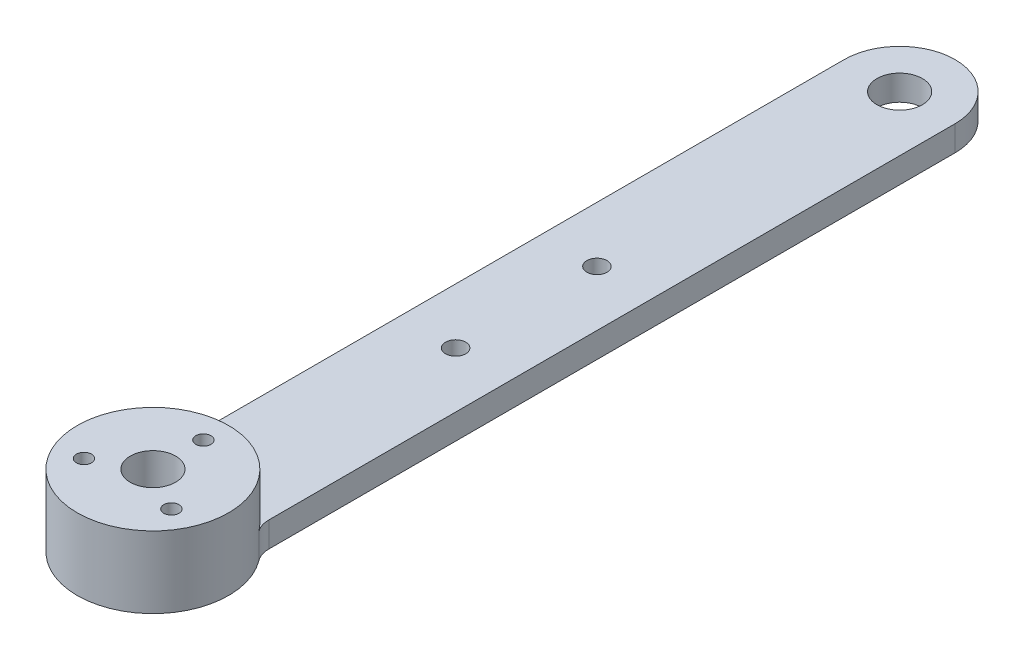
ISO-10303-21;
HEADER;
FILE_DESCRIPTION(('STEP AP214'),'2;1');
FILE_NAME('part.step','',(''),(''),'','','');
FILE_SCHEMA(('AUTOMOTIVE_DESIGN { 1 0 10303 214 1 1 1 1 }'));
ENDSEC;
DATA;
#1=APPLICATION_CONTEXT('core data for automotive mechanical design processes');
#2=APPLICATION_PROTOCOL_DEFINITION('international standard','automotive_design',2000,#1);
#3=PRODUCT_CONTEXT('',#1,'mechanical');
#4=PRODUCT('Part','Part','',(#3));
#5=PRODUCT_RELATED_PRODUCT_CATEGORY('part','',(#4));
#6=PRODUCT_DEFINITION_FORMATION('','',#4);
#7=PRODUCT_DEFINITION_CONTEXT('part definition',#1,'design');
#8=PRODUCT_DEFINITION('design','',#6,#7);
#9=PRODUCT_DEFINITION_SHAPE('','',#8);
#10=(LENGTH_UNIT() NAMED_UNIT(*) SI_UNIT(.MILLI.,.METRE.));
#11=(NAMED_UNIT(*) PLANE_ANGLE_UNIT() SI_UNIT($,.RADIAN.));
#12=(NAMED_UNIT(*) SI_UNIT($,.STERADIAN.) SOLID_ANGLE_UNIT());
#13=UNCERTAINTY_MEASURE_WITH_UNIT(LENGTH_MEASURE(1.E-05),#10,'distance_accuracy_value','');
#14=(GEOMETRIC_REPRESENTATION_CONTEXT(3) GLOBAL_UNCERTAINTY_ASSIGNED_CONTEXT((#13)) GLOBAL_UNIT_ASSIGNED_CONTEXT((#10,
#11,#12)) REPRESENTATION_CONTEXT('',''));
#15=CARTESIAN_POINT('',(0.,0.,0.));
#16=DIRECTION('',(0.,0.,1.));
#17=DIRECTION('',(1.,0.,0.));
#18=AXIS2_PLACEMENT_3D('',#15,#16,#17);
#19=CARTESIAN_POINT('',(-56.5371179039301,5.,-79.1703056768558));
#20=DIRECTION('',(0.,1.,0.));
#21=DIRECTION('',(0.,0.,1.));
#22=AXIS2_PLACEMENT_3D('',#19,#20,#21);
#23=PLANE('',#22);
#24=CARTESIAN_POINT('',(-56.5371179039301,5.,68.8296943231442));
#25=DIRECTION('',(0.,1.,0.));
#26=DIRECTION('',(0.,0.,1.));
#27=AXIS2_PLACEMENT_3D('',#24,#25,#26);
#28=CIRCLE('',#27,15.);
#29=CARTESIAN_POINT('',(-44.5371179039301,5.,59.8296943231442));
#30=VERTEX_POINT('',#29);
#31=CARTESIAN_POINT('',(-68.5371179039301,5.,59.8296943231442));
#32=VERTEX_POINT('',#31);
#33=EDGE_CURVE('E105',#30,#32,#28,.T.);
#34=ORIENTED_EDGE('',*,*,#33,.F.);
#35=CARTESIAN_POINT('',(-40.5371179039301,5.,56.8296943231442));
#36=DIRECTION('',(0.,-1.,0.));
#37=DIRECTION('',(0.,0.,1.));
#38=AXIS2_PLACEMENT_3D('',#35,#36,#37);
#39=CIRCLE('',#38,5.);
#40=CARTESIAN_POINT('',(-45.5371179039301,5.,56.8296943231442));
#41=VERTEX_POINT('',#40);
#42=EDGE_CURVE('E109',#30,#41,#39,.T.);
#43=ORIENTED_EDGE('',*,*,#42,.T.);
#44=DIRECTION('',(0.,0.,-1.));
#45=VECTOR('',#44,1.);
#46=CARTESIAN_POINT('',(-45.5371179039301,5.,-79.1703056768558));
#47=LINE('',#46,#45);
#48=CARTESIAN_POINT('',(-45.5371179039301,5.,-79.1703056768558));
#49=VERTEX_POINT('',#48);
#50=EDGE_CURVE('E57',#41,#49,#47,.T.);
#51=ORIENTED_EDGE('',*,*,#50,.T.);
#52=CARTESIAN_POINT('',(-56.5371179039301,5.,-79.1703056768558));
#53=DIRECTION('',(0.,1.,0.));
#54=DIRECTION('',(0.,0.,1.));
#55=AXIS2_PLACEMENT_3D('',#52,#53,#54);
#56=CIRCLE('',#55,11.);
#57=CARTESIAN_POINT('',(-67.5371179039301,5.,-79.1703056768558));
#58=VERTEX_POINT('',#57);
#59=EDGE_CURVE('E177',#49,#58,#56,.T.);
#60=ORIENTED_EDGE('',*,*,#59,.T.);
#61=DIRECTION('',(0.,0.,1.));
#62=VECTOR('',#61,1.);
#63=CARTESIAN_POINT('',(-67.5371179039301,5.,-79.1703056768558));
#64=LINE('',#63,#62);
#65=CARTESIAN_POINT('',(-67.5371179039301,5.,56.8296943231442));
#66=VERTEX_POINT('',#65);
#67=EDGE_CURVE('E95',#58,#66,#64,.T.);
#68=ORIENTED_EDGE('',*,*,#67,.T.);
#69=CARTESIAN_POINT('',(-72.5371179039301,5.,56.8296943231442));
#70=DIRECTION('',(0.,-1.,0.));
#71=DIRECTION('',(0.,0.,-1.));
#72=AXIS2_PLACEMENT_3D('',#69,#70,#71);
#73=CIRCLE('',#72,5.);
#74=EDGE_CURVE('E101',#66,#32,#73,.T.);
#75=ORIENTED_EDGE('',*,*,#74,.T.);
#76=EDGE_LOOP('',(#34,#43,#51,#60,#68,#75));
#77=FACE_BOUND('',#76,.T.);
#78=CARTESIAN_POINT('',(-56.5371179039301,5.,-19.1703056768558));
#79=DIRECTION('',(0.,1.,0.));
#80=DIRECTION('',(0.,0.,1.));
#81=AXIS2_PLACEMENT_3D('',#78,#79,#80);
#82=CIRCLE('',#81,2.);
#83=CARTESIAN_POINT('',(-56.5371179039301,5.,-17.1703056768558));
#84=VERTEX_POINT('',#83);
#85=EDGE_CURVE('E161',#84,#84,#82,.T.);
#86=ORIENTED_EDGE('',*,*,#85,.F.);
#87=EDGE_LOOP('',(#86));
#88=FACE_BOUND('',#87,.T.);
#89=CARTESIAN_POINT('',(-56.5371179039301,5.,-79.1703056768558));
#90=DIRECTION('',(0.,1.,0.));
#91=DIRECTION('',(0.,0.,1.));
#92=AXIS2_PLACEMENT_3D('',#89,#90,#91);
#93=CIRCLE('',#92,4.5);
#94=CARTESIAN_POINT('',(-56.5371179039301,5.,-74.6703056768558));
#95=VERTEX_POINT('',#94);
#96=EDGE_CURVE('E169',#95,#95,#93,.T.);
#97=ORIENTED_EDGE('',*,*,#96,.F.);
#98=EDGE_LOOP('',(#97));
#99=FACE_BOUND('',#98,.T.);
#100=CARTESIAN_POINT('',(-56.5371179039301,5.,8.82969432314421));
#101=DIRECTION('',(0.,1.,0.));
#102=DIRECTION('',(0.,0.,1.));
#103=AXIS2_PLACEMENT_3D('',#100,#101,#102);
#104=CIRCLE('',#103,2.);
#105=CARTESIAN_POINT('',(-56.5371179039301,5.,10.8296943231442));
#106=VERTEX_POINT('',#105);
#107=EDGE_CURVE('E153',#106,#106,#104,.T.);
#108=ORIENTED_EDGE('',*,*,#107,.F.);
#109=EDGE_LOOP('',(#108));
#110=FACE_BOUND('',#109,.T.);
#111=ADVANCED_FACE('F39',(#77,#88,#99,#110),#23,.T.);
#112=CARTESIAN_POINT('',(-56.5371179039301,0.,-79.1703056768558));
#113=DIRECTION('',(0.,1.,0.));
#114=DIRECTION('',(0.,0.,1.));
#115=AXIS2_PLACEMENT_3D('',#112,#113,#114);
#116=PLANE('',#115);
#117=CARTESIAN_POINT('',(-56.5371179039301,0.,-79.1703056768558));
#118=DIRECTION('',(0.,1.,0.));
#119=DIRECTION('',(0.,0.,1.));
#120=AXIS2_PLACEMENT_3D('',#117,#118,#119);
#121=CIRCLE('',#120,11.);
#122=CARTESIAN_POINT('',(-45.5371179039301,0.,-79.1703056768558));
#123=VERTEX_POINT('',#122);
#124=CARTESIAN_POINT('',(-67.5371179039301,0.,-79.1703056768558));
#125=VERTEX_POINT('',#124);
#126=EDGE_CURVE('E173',#123,#125,#121,.T.);
#127=ORIENTED_EDGE('',*,*,#126,.F.);
#128=DIRECTION('',(0.,0.,-1.));
#129=VECTOR('',#128,1.);
#130=CARTESIAN_POINT('',(-45.5371179039301,0.,-79.1703056768558));
#131=LINE('',#130,#129);
#132=CARTESIAN_POINT('',(-45.5371179039301,0.,56.8296943231442));
#133=VERTEX_POINT('',#132);
#134=EDGE_CURVE('E87',#133,#123,#131,.T.);
#135=ORIENTED_EDGE('',*,*,#134,.F.);
#136=CARTESIAN_POINT('',(-40.5371179039301,0.,56.8296943231442));
#137=DIRECTION('',(0.,-1.,0.));
#138=DIRECTION('',(0.,0.,1.));
#139=AXIS2_PLACEMENT_3D('',#136,#137,#138);
#140=CIRCLE('',#139,5.);
#141=CARTESIAN_POINT('',(-44.5371179039301,0.,59.8296943231442));
#142=VERTEX_POINT('',#141);
#143=EDGE_CURVE('E81',#142,#133,#140,.T.);
#144=ORIENTED_EDGE('',*,*,#143,.F.);
#145=CARTESIAN_POINT('',(-56.5371179039301,0.,68.8296943231442));
#146=DIRECTION('',(0.,1.,0.));
#147=DIRECTION('',(0.,0.,1.));
#148=AXIS2_PLACEMENT_3D('',#145,#146,#147);
#149=CIRCLE('',#148,15.);
#150=CARTESIAN_POINT('',(-68.5371179039301,0.,59.8296943231442));
#151=VERTEX_POINT('',#150);
#152=EDGE_CURVE('E195',#151,#142,#149,.T.);
#153=ORIENTED_EDGE('',*,*,#152,.F.);
#154=CARTESIAN_POINT('',(-72.5371179039301,0.,56.8296943231442));
#155=DIRECTION('',(0.,-1.,0.));
#156=DIRECTION('',(0.,0.,-1.));
#157=AXIS2_PLACEMENT_3D('',#154,#155,#156);
#158=CIRCLE('',#157,5.);
#159=CARTESIAN_POINT('',(-67.5371179039301,0.,56.8296943231442));
#160=VERTEX_POINT('',#159);
#161=EDGE_CURVE('E115',#160,#151,#158,.T.);
#162=ORIENTED_EDGE('',*,*,#161,.F.);
#163=DIRECTION('',(0.,0.,1.));
#164=VECTOR('',#163,1.);
#165=CARTESIAN_POINT('',(-67.5371179039301,0.,-79.1703056768558));
#166=LINE('',#165,#164);
#167=EDGE_CURVE('E190',#125,#160,#166,.T.);
#168=ORIENTED_EDGE('',*,*,#167,.F.);
#169=EDGE_LOOP('',(#127,#135,#144,#153,#162,#168));
#170=FACE_BOUND('',#169,.T.);
#171=CARTESIAN_POINT('',(-56.5371179039301,0.,-79.1703056768558));
#172=DIRECTION('',(0.,1.,0.));
#173=DIRECTION('',(0.,0.,1.));
#174=AXIS2_PLACEMENT_3D('',#171,#172,#173);
#175=CIRCLE('',#174,4.5);
#176=CARTESIAN_POINT('',(-56.5371179039301,0.,-74.6703056768558));
#177=VERTEX_POINT('',#176);
#178=EDGE_CURVE('E165',#177,#177,#175,.T.);
#179=ORIENTED_EDGE('',*,*,#178,.T.);
#180=EDGE_LOOP('',(#179));
#181=FACE_BOUND('',#180,.T.);
#182=CARTESIAN_POINT('',(-56.5371179039301,0.,-19.1703056768558));
#183=DIRECTION('',(0.,1.,0.));
#184=DIRECTION('',(0.,0.,1.));
#185=AXIS2_PLACEMENT_3D('',#182,#183,#184);
#186=CIRCLE('',#185,2.);
#187=CARTESIAN_POINT('',(-56.5371179039301,0.,-17.1703056768558));
#188=VERTEX_POINT('',#187);
#189=EDGE_CURVE('E157',#188,#188,#186,.T.);
#190=ORIENTED_EDGE('',*,*,#189,.T.);
#191=EDGE_LOOP('',(#190));
#192=FACE_BOUND('',#191,.T.);
#193=CARTESIAN_POINT('',(-56.5371179039301,0.,8.82969432314421));
#194=DIRECTION('',(0.,1.,0.));
#195=DIRECTION('',(0.,0.,1.));
#196=AXIS2_PLACEMENT_3D('',#193,#194,#195);
#197=CIRCLE('',#196,2.);
#198=CARTESIAN_POINT('',(-56.5371179039301,0.,10.8296943231442));
#199=VERTEX_POINT('',#198);
#200=EDGE_CURVE('E152',#199,#199,#197,.T.);
#201=ORIENTED_EDGE('',*,*,#200,.T.);
#202=EDGE_LOOP('',(#201));
#203=FACE_BOUND('',#202,.T.);
#204=CARTESIAN_POINT('',(-56.5371179039301,0.,68.8296943231442));
#205=DIRECTION('',(0.,1.,0.));
#206=DIRECTION('',(0.,0.,1.));
#207=AXIS2_PLACEMENT_3D('',#204,#205,#206);
#208=CIRCLE('',#207,4.5);
#209=CARTESIAN_POINT('',(-56.5371179039301,0.,73.3296943231442));
#210=VERTEX_POINT('',#209);
#211=EDGE_CURVE('E148',#210,#210,#208,.T.);
#212=ORIENTED_EDGE('',*,*,#211,.T.);
#213=EDGE_LOOP('',(#212));
#214=FACE_BOUND('',#213,.T.);
#215=CARTESIAN_POINT('',(-65.1973719417745,0.,73.8296943231443));
#216=DIRECTION('',(0.,1.,0.));
#217=DIRECTION('',(0.,0.,1.));
#218=AXIS2_PLACEMENT_3D('',#215,#216,#217);
#219=CIRCLE('',#218,1.5);
#220=CARTESIAN_POINT('',(-65.1973719417745,0.,75.3296943231443));
#221=VERTEX_POINT('',#220);
#222=EDGE_CURVE('E144',#221,#221,#219,.T.);
#223=ORIENTED_EDGE('',*,*,#222,.T.);
#224=EDGE_LOOP('',(#223));
#225=FACE_BOUND('',#224,.T.);
#226=CARTESIAN_POINT('',(-47.8768638660856,0.,73.8296943231441));
#227=DIRECTION('',(0.,1.,0.));
#228=DIRECTION('',(0.,0.,1.));
#229=AXIS2_PLACEMENT_3D('',#226,#227,#228);
#230=CIRCLE('',#229,1.49999999999997);
#231=CARTESIAN_POINT('',(-47.8768638660856,0.,75.3296943231441));
#232=VERTEX_POINT('',#231);
#233=EDGE_CURVE('E140',#232,#232,#230,.T.);
#234=ORIENTED_EDGE('',*,*,#233,.T.);
#235=EDGE_LOOP('',(#234));
#236=FACE_BOUND('',#235,.T.);
#237=CARTESIAN_POINT('',(-56.5371179039301,0.,58.8296943231442));
#238=DIRECTION('',(0.,1.,0.));
#239=DIRECTION('',(0.,0.,1.));
#240=AXIS2_PLACEMENT_3D('',#237,#238,#239);
#241=CIRCLE('',#240,1.5);
#242=CARTESIAN_POINT('',(-56.5371179039301,0.,60.3296943231442));
#243=VERTEX_POINT('',#242);
#244=EDGE_CURVE('E131',#243,#243,#241,.T.);
#245=ORIENTED_EDGE('',*,*,#244,.T.);
#246=EDGE_LOOP('',(#245));
#247=FACE_BOUND('',#246,.T.);
#248=ADVANCED_FACE('F211',(#170,#181,#192,#203,#214,#225,#236,#247),#116,.F.);
#249=CARTESIAN_POINT('',(-56.5371179039301,5.,-79.1703056768558));
#250=DIRECTION('',(0.,-1.,0.));
#251=DIRECTION('',(0.,0.,-1.));
#252=AXIS2_PLACEMENT_3D('',#249,#250,#251);
#253=CYLINDRICAL_SURFACE('',#252,11.);
#254=ORIENTED_EDGE('',*,*,#126,.T.);
#255=DIRECTION('',(0.,-1.,0.));
#256=VECTOR('',#255,1.);
#257=CARTESIAN_POINT('',(-67.5371179039301,5.,-79.1703056768558));
#258=LINE('',#257,#256);
#259=EDGE_CURVE('E11',#58,#125,#258,.T.);
#260=ORIENTED_EDGE('',*,*,#259,.F.);
#261=ORIENTED_EDGE('',*,*,#59,.F.);
#262=DIRECTION('',(0.,-1.,0.));
#263=VECTOR('',#262,1.);
#264=CARTESIAN_POINT('',(-45.5371179039301,5.,-79.1703056768558));
#265=LINE('',#264,#263);
#266=EDGE_CURVE('E186',#49,#123,#265,.T.);
#267=ORIENTED_EDGE('',*,*,#266,.T.);
#268=EDGE_LOOP('',(#254,#260,#261,#267));
#269=FACE_BOUND('',#268,.T.);
#270=ADVANCED_FACE('F41',(#269),#253,.T.);
#271=CARTESIAN_POINT('',(-67.5371179039301,5.,-79.1703056768558));
#272=DIRECTION('',(1.,0.,0.));
#273=DIRECTION('',(0.,0.,-1.));
#274=AXIS2_PLACEMENT_3D('',#271,#272,#273);
#275=PLANE('',#274);
#276=ORIENTED_EDGE('',*,*,#167,.T.);
#277=DIRECTION('',(0.,-1.,0.));
#278=VECTOR('',#277,1.);
#279=CARTESIAN_POINT('',(-67.5371179039301,5.,56.8296943231442));
#280=LINE('',#279,#278);
#281=EDGE_CURVE('E49',#66,#160,#280,.T.);
#282=ORIENTED_EDGE('',*,*,#281,.F.);
#283=ORIENTED_EDGE('',*,*,#67,.F.);
#284=ORIENTED_EDGE('',*,*,#259,.T.);
#285=EDGE_LOOP('',(#276,#282,#283,#284));
#286=FACE_BOUND('',#285,.T.);
#287=ADVANCED_FACE('F219',(#286),#275,.F.);
#288=CARTESIAN_POINT('',(-72.5371179039301,5.,56.8296943231442));
#289=DIRECTION('',(0.,-1.,0.));
#290=DIRECTION('',(0.,0.,-1.));
#291=AXIS2_PLACEMENT_3D('',#288,#289,#290);
#292=CYLINDRICAL_SURFACE('',#291,5.);
#293=ORIENTED_EDGE('',*,*,#161,.T.);
#294=DIRECTION('',(0.,-1.,0.));
#295=VECTOR('',#294,1.);
#296=CARTESIAN_POINT('',(-68.5371179039301,5.,59.8296943231442));
#297=LINE('',#296,#295);
#298=EDGE_CURVE('E112',#32,#151,#297,.T.);
#299=ORIENTED_EDGE('',*,*,#298,.F.);
#300=ORIENTED_EDGE('',*,*,#74,.F.);
#301=ORIENTED_EDGE('',*,*,#281,.T.);
#302=EDGE_LOOP('',(#293,#299,#300,#301));
#303=FACE_BOUND('',#302,.T.);
#304=ADVANCED_FACE('F113',(#303),#292,.F.);
#305=CARTESIAN_POINT('',(-56.5371179039301,5.,68.8296943231442));
#306=DIRECTION('',(0.,-1.,0.));
#307=DIRECTION('',(0.,0.,-1.));
#308=AXIS2_PLACEMENT_3D('',#305,#306,#307);
#309=CYLINDRICAL_SURFACE('',#308,15.);
#310=ORIENTED_EDGE('',*,*,#152,.T.);
#311=DIRECTION('',(0.,-1.,0.));
#312=VECTOR('',#311,1.);
#313=CARTESIAN_POINT('',(-44.5371179039301,5.,59.8296943231442));
#314=LINE('',#313,#312);
#315=EDGE_CURVE('E119',#30,#142,#314,.T.);
#316=ORIENTED_EDGE('',*,*,#315,.F.);
#317=ORIENTED_EDGE('',*,*,#33,.T.);
#318=ORIENTED_EDGE('',*,*,#298,.T.);
#319=EDGE_LOOP('',(#310,#316,#317,#318));
#320=FACE_BOUND('',#319,.T.);
#321=CARTESIAN_POINT('',(-56.5371179039301,14.2,68.8296943231442));
#322=DIRECTION('',(0.,1.,0.));
#323=DIRECTION('',(0.,0.,1.));
#324=AXIS2_PLACEMENT_3D('',#321,#322,#323);
#325=CIRCLE('',#324,15.);
#326=CARTESIAN_POINT('',(-56.5371179039301,14.2,83.8296943231442));
#327=VERTEX_POINT('',#326);
#328=EDGE_CURVE('E125',#327,#327,#325,.T.);
#329=ORIENTED_EDGE('',*,*,#328,.F.);
#330=EDGE_LOOP('',(#329));
#331=FACE_BOUND('',#330,.T.);
#332=ADVANCED_FACE('F122',(#320,#331),#309,.T.);
#333=CARTESIAN_POINT('',(-40.5371179039301,5.,56.8296943231442));
#334=DIRECTION('',(0.,-1.,0.));
#335=DIRECTION('',(0.,0.,-1.));
#336=AXIS2_PLACEMENT_3D('',#333,#334,#335);
#337=CYLINDRICAL_SURFACE('',#336,5.);
#338=ORIENTED_EDGE('',*,*,#143,.T.);
#339=DIRECTION('',(0.,-1.,0.));
#340=VECTOR('',#339,1.);
#341=CARTESIAN_POINT('',(-45.5371179039301,5.,56.8296943231442));
#342=LINE('',#341,#340);
#343=EDGE_CURVE('E204',#41,#133,#342,.T.);
#344=ORIENTED_EDGE('',*,*,#343,.F.);
#345=ORIENTED_EDGE('',*,*,#42,.F.);
#346=ORIENTED_EDGE('',*,*,#315,.T.);
#347=EDGE_LOOP('',(#338,#344,#345,#346));
#348=FACE_BOUND('',#347,.T.);
#349=ADVANCED_FACE('F214',(#348),#337,.F.);
#350=CARTESIAN_POINT('',(-45.5371179039301,5.,-79.1703056768558));
#351=DIRECTION('',(-1.,0.,0.));
#352=DIRECTION('',(0.,0.,1.));
#353=AXIS2_PLACEMENT_3D('',#350,#351,#352);
#354=PLANE('',#353);
#355=ORIENTED_EDGE('',*,*,#134,.T.);
#356=ORIENTED_EDGE('',*,*,#266,.F.);
#357=ORIENTED_EDGE('',*,*,#50,.F.);
#358=ORIENTED_EDGE('',*,*,#343,.T.);
#359=EDGE_LOOP('',(#355,#356,#357,#358));
#360=FACE_BOUND('',#359,.T.);
#361=ADVANCED_FACE('F215',(#360),#354,.F.);
#362=CARTESIAN_POINT('',(-56.5371179039301,5.,-79.1703056768558));
#363=DIRECTION('',(0.,-1.,0.));
#364=DIRECTION('',(0.,0.,-1.));
#365=AXIS2_PLACEMENT_3D('',#362,#363,#364);
#366=CYLINDRICAL_SURFACE('',#365,4.5);
#367=ORIENTED_EDGE('',*,*,#96,.T.);
#368=EDGE_LOOP('',(#367));
#369=FACE_BOUND('',#368,.T.);
#370=ORIENTED_EDGE('',*,*,#178,.F.);
#371=EDGE_LOOP('',(#370));
#372=FACE_BOUND('',#371,.T.);
#373=ADVANCED_FACE('F233',(#369,#372),#366,.F.);
#374=CARTESIAN_POINT('',(-56.5371179039301,5.,-19.1703056768558));
#375=DIRECTION('',(0.,-1.,0.));
#376=DIRECTION('',(0.,0.,-1.));
#377=AXIS2_PLACEMENT_3D('',#374,#375,#376);
#378=CYLINDRICAL_SURFACE('',#377,2.);
#379=ORIENTED_EDGE('',*,*,#85,.T.);
#380=EDGE_LOOP('',(#379));
#381=FACE_BOUND('',#380,.T.);
#382=ORIENTED_EDGE('',*,*,#189,.F.);
#383=EDGE_LOOP('',(#382));
#384=FACE_BOUND('',#383,.T.);
#385=ADVANCED_FACE('F260',(#381,#384),#378,.F.);
#386=CARTESIAN_POINT('',(-56.5371179039301,5.,8.82969432314421));
#387=DIRECTION('',(0.,-1.,0.));
#388=DIRECTION('',(0.,0.,-1.));
#389=AXIS2_PLACEMENT_3D('',#386,#387,#388);
#390=CYLINDRICAL_SURFACE('',#389,2.);
#391=ORIENTED_EDGE('',*,*,#107,.T.);
#392=EDGE_LOOP('',(#391));
#393=FACE_BOUND('',#392,.T.);
#394=ORIENTED_EDGE('',*,*,#200,.F.);
#395=EDGE_LOOP('',(#394));
#396=FACE_BOUND('',#395,.T.);
#397=ADVANCED_FACE('F267',(#393,#396),#390,.F.);
#398=CARTESIAN_POINT('',(-56.5371179039301,5.,68.8296943231442));
#399=DIRECTION('',(0.,-1.,0.));
#400=DIRECTION('',(0.,0.,-1.));
#401=AXIS2_PLACEMENT_3D('',#398,#399,#400);
#402=CYLINDRICAL_SURFACE('',#401,4.5);
#403=ORIENTED_EDGE('',*,*,#211,.F.);
#404=EDGE_LOOP('',(#403));
#405=FACE_BOUND('',#404,.T.);
#406=CARTESIAN_POINT('',(-56.5371179039301,14.2,68.8296943231442));
#407=DIRECTION('',(0.,1.,0.));
#408=DIRECTION('',(0.,0.,1.));
#409=AXIS2_PLACEMENT_3D('',#406,#407,#408);
#410=CIRCLE('',#409,4.50000000000001);
#411=CARTESIAN_POINT('',(-56.5371179039301,14.2,73.3296943231442));
#412=VERTEX_POINT('',#411);
#413=EDGE_CURVE('E390',#412,#412,#410,.T.);
#414=ORIENTED_EDGE('',*,*,#413,.T.);
#415=EDGE_LOOP('',(#414));
#416=FACE_BOUND('',#415,.T.);
#417=ADVANCED_FACE('F274',(#405,#416),#402,.F.);
#418=CARTESIAN_POINT('',(-65.1973719417745,5.,73.8296943231443));
#419=DIRECTION('',(0.,-1.,0.));
#420=DIRECTION('',(0.,0.,-1.));
#421=AXIS2_PLACEMENT_3D('',#418,#419,#420);
#422=CYLINDRICAL_SURFACE('',#421,1.5);
#423=ORIENTED_EDGE('',*,*,#222,.F.);
#424=EDGE_LOOP('',(#423));
#425=FACE_BOUND('',#424,.T.);
#426=CARTESIAN_POINT('',(-65.1973719417745,14.2,73.8296943231443));
#427=DIRECTION('',(0.,1.,0.));
#428=DIRECTION('',(0.,0.,1.));
#429=AXIS2_PLACEMENT_3D('',#426,#427,#428);
#430=CIRCLE('',#429,1.50000000000001);
#431=CARTESIAN_POINT('',(-65.1973719417745,14.2,75.3296943231443));
#432=VERTEX_POINT('',#431);
#433=EDGE_CURVE('E126',#432,#432,#430,.T.);
#434=ORIENTED_EDGE('',*,*,#433,.T.);
#435=EDGE_LOOP('',(#434));
#436=FACE_BOUND('',#435,.T.);
#437=ADVANCED_FACE('F281',(#425,#436),#422,.F.);
#438=CARTESIAN_POINT('',(-47.8768638660856,5.,73.8296943231441));
#439=DIRECTION('',(0.,-1.,0.));
#440=DIRECTION('',(0.,0.,-1.));
#441=AXIS2_PLACEMENT_3D('',#438,#439,#440);
#442=CYLINDRICAL_SURFACE('',#441,1.49999999999997);
#443=ORIENTED_EDGE('',*,*,#233,.F.);
#444=EDGE_LOOP('',(#443));
#445=FACE_BOUND('',#444,.T.);
#446=CARTESIAN_POINT('',(-47.8768638660856,14.2,73.8296943231441));
#447=DIRECTION('',(0.,1.,0.));
#448=DIRECTION('',(0.,0.,1.));
#449=AXIS2_PLACEMENT_3D('',#446,#447,#448);
#450=CIRCLE('',#449,1.49999999999997);
#451=CARTESIAN_POINT('',(-47.8768638660856,14.2,75.3296943231441));
#452=VERTEX_POINT('',#451);
#453=EDGE_CURVE('E380',#452,#452,#450,.T.);
#454=ORIENTED_EDGE('',*,*,#453,.T.);
#455=EDGE_LOOP('',(#454));
#456=FACE_BOUND('',#455,.T.);
#457=ADVANCED_FACE('F289',(#445,#456),#442,.F.);
#458=CARTESIAN_POINT('',(-56.5371179039301,5.,58.8296943231442));
#459=DIRECTION('',(0.,-1.,0.));
#460=DIRECTION('',(0.,0.,-1.));
#461=AXIS2_PLACEMENT_3D('',#458,#459,#460);
#462=CYLINDRICAL_SURFACE('',#461,1.5);
#463=ORIENTED_EDGE('',*,*,#244,.F.);
#464=EDGE_LOOP('',(#463));
#465=FACE_BOUND('',#464,.T.);
#466=CARTESIAN_POINT('',(-56.5371179039301,14.2,58.8296943231442));
#467=DIRECTION('',(0.,1.,0.));
#468=DIRECTION('',(0.,0.,1.));
#469=AXIS2_PLACEMENT_3D('',#466,#467,#468);
#470=CIRCLE('',#469,1.5);
#471=CARTESIAN_POINT('',(-56.5371179039301,14.2,60.3296943231442));
#472=VERTEX_POINT('',#471);
#473=EDGE_CURVE('E134',#472,#472,#470,.T.);
#474=ORIENTED_EDGE('',*,*,#473,.T.);
#475=EDGE_LOOP('',(#474));
#476=FACE_BOUND('',#475,.T.);
#477=ADVANCED_FACE('F297',(#465,#476),#462,.F.);
#478=CARTESIAN_POINT('',(-56.5371179039301,14.2,68.8296943231442));
#479=DIRECTION('',(0.,1.,0.));
#480=DIRECTION('',(0.,0.,1.));
#481=AXIS2_PLACEMENT_3D('',#478,#479,#480);
#482=PLANE('',#481);
#483=ORIENTED_EDGE('',*,*,#453,.F.);
#484=EDGE_LOOP('',(#483));
#485=FACE_BOUND('',#484,.T.);
#486=ORIENTED_EDGE('',*,*,#433,.F.);
#487=EDGE_LOOP('',(#486));
#488=FACE_BOUND('',#487,.T.);
#489=ORIENTED_EDGE('',*,*,#328,.T.);
#490=EDGE_LOOP('',(#489));
#491=FACE_BOUND('',#490,.T.);
#492=ORIENTED_EDGE('',*,*,#473,.F.);
#493=EDGE_LOOP('',(#492));
#494=FACE_BOUND('',#493,.T.);
#495=ORIENTED_EDGE('',*,*,#413,.F.);
#496=EDGE_LOOP('',(#495));
#497=FACE_BOUND('',#496,.T.);
#498=ADVANCED_FACE('F305',(#485,#488,#491,#494,#497),#482,.T.);
#499=CLOSED_SHELL('',(#111,#248,#270,#287,#304,#332,#349,#361,#373,#385,#397,#417,#437,#457,
#477,#498));
#500=MANIFOLD_SOLID_BREP('B2',#499);
#501=ADVANCED_BREP_SHAPE_REPRESENTATION('',(#18,#500),#14);
#502=SHAPE_DEFINITION_REPRESENTATION(#9,#501);
ENDSEC;
END-ISO-10303-21;
